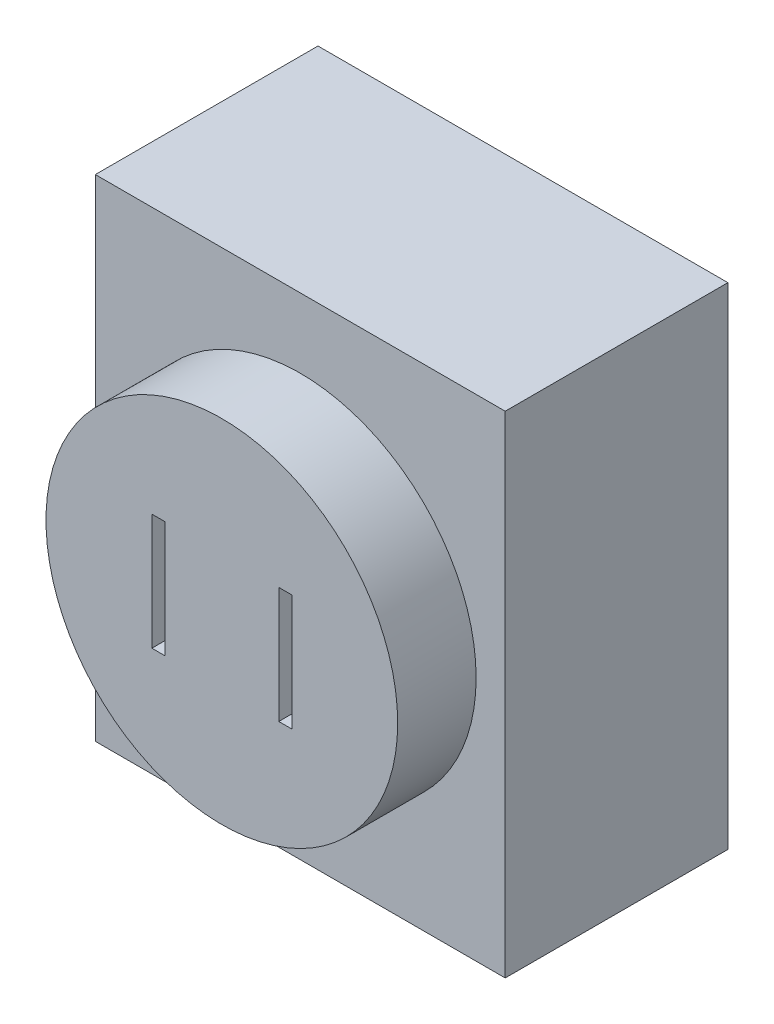
ISO-10303-21;
HEADER;
FILE_DESCRIPTION(('STEP AP214'),'2;1');
FILE_NAME('part.step','',(''),(''),'','','');
FILE_SCHEMA(('AUTOMOTIVE_DESIGN { 1 0 10303 214 1 1 1 1 }'));
ENDSEC;
DATA;
#1=APPLICATION_CONTEXT('core data for automotive mechanical design processes');
#2=APPLICATION_PROTOCOL_DEFINITION('international standard','automotive_design',2000,#1);
#3=PRODUCT_CONTEXT('',#1,'mechanical');
#4=PRODUCT('Part','Part','',(#3));
#5=PRODUCT_RELATED_PRODUCT_CATEGORY('part','',(#4));
#6=PRODUCT_DEFINITION_FORMATION('','',#4);
#7=PRODUCT_DEFINITION_CONTEXT('part definition',#1,'design');
#8=PRODUCT_DEFINITION('design','',#6,#7);
#9=PRODUCT_DEFINITION_SHAPE('','',#8);
#10=(LENGTH_UNIT() NAMED_UNIT(*) SI_UNIT(.MILLI.,.METRE.));
#11=(NAMED_UNIT(*) PLANE_ANGLE_UNIT() SI_UNIT($,.RADIAN.));
#12=(NAMED_UNIT(*) SI_UNIT($,.STERADIAN.) SOLID_ANGLE_UNIT());
#13=UNCERTAINTY_MEASURE_WITH_UNIT(LENGTH_MEASURE(1.E-05),#10,'distance_accuracy_value','');
#14=(GEOMETRIC_REPRESENTATION_CONTEXT(3) GLOBAL_UNCERTAINTY_ASSIGNED_CONTEXT((#13)) GLOBAL_UNIT_ASSIGNED_CONTEXT((#10,
#11,#12)) REPRESENTATION_CONTEXT('',''));
#15=CARTESIAN_POINT('',(0.,0.,0.));
#16=DIRECTION('',(0.,0.,1.));
#17=DIRECTION('',(1.,0.,0.));
#18=AXIS2_PLACEMENT_3D('',#15,#16,#17);
#19=CARTESIAN_POINT('',(14.859,30.4668283761168,30.226));
#20=DIRECTION('',(0.,1.,0.));
#21=DIRECTION('',(0.,0.,1.));
#22=AXIS2_PLACEMENT_3D('',#19,#20,#21);
#23=PLANE('',#22);
#24=DIRECTION('',(1.,0.,0.));
#25=VECTOR('',#24,1.);
#26=CARTESIAN_POINT('',(0.,30.4668283761168,22.2758));
#27=LINE('',#26,#25);
#28=CARTESIAN_POINT('',(14.859,30.4668283761168,22.2758));
#29=VERTEX_POINT('',#28);
#30=CARTESIAN_POINT('',(13.5508801004094,30.4668283761168,22.2758));
#31=VERTEX_POINT('',#30);
#32=EDGE_CURVE('E102',#29,#31,#27,.F.);
#33=ORIENTED_EDGE('',*,*,#32,.F.);
#34=DIRECTION('',(0.,0.,-1.));
#35=VECTOR('',#34,1.);
#36=CARTESIAN_POINT('',(14.859,30.4668283761168,30.226));
#37=LINE('',#36,#35);
#38=CARTESIAN_POINT('',(14.859,30.4668283761168,30.226));
#39=VERTEX_POINT('',#38);
#40=EDGE_CURVE('E127',#29,#39,#37,.F.);
#41=ORIENTED_EDGE('',*,*,#40,.T.);
#42=DIRECTION('',(1.,0.,0.));
#43=VECTOR('',#42,1.);
#44=CARTESIAN_POINT('',(14.859,30.4668283761168,30.226));
#45=LINE('',#44,#43);
#46=CARTESIAN_POINT('',(13.5508801004094,30.4668283761168,30.226));
#47=VERTEX_POINT('',#46);
#48=EDGE_CURVE('E142',#47,#39,#45,.T.);
#49=ORIENTED_EDGE('',*,*,#48,.F.);
#50=DIRECTION('',(0.,0.,1.));
#51=VECTOR('',#50,1.);
#52=CARTESIAN_POINT('',(13.5508801004094,30.4668283761168,30.226));
#53=LINE('',#52,#51);
#54=EDGE_CURVE('E189',#47,#31,#53,.F.);
#55=ORIENTED_EDGE('',*,*,#54,.T.);
#56=EDGE_LOOP('',(#33,#41,#49,#55));
#57=FACE_BOUND('',#56,.T.);
#58=ADVANCED_FACE('F17',(#57),#23,.F.);
#59=CARTESIAN_POINT('',(0.,0.,22.2758));
#60=DIRECTION('',(0.,0.,1.));
#61=DIRECTION('',(1.,0.,0.));
#62=AXIS2_PLACEMENT_3D('',#59,#60,#61);
#63=PLANE('',#62);
#64=ORIENTED_EDGE('',*,*,#32,.T.);
#65=DIRECTION('',(0.,1.,0.));
#66=VECTOR('',#65,1.);
#67=CARTESIAN_POINT('',(13.5508801004094,30.4668283761168,22.2758));
#68=LINE('',#67,#66);
#69=CARTESIAN_POINT('',(13.5508801004094,18.8091716238832,22.2758));
#70=VERTEX_POINT('',#69);
#71=EDGE_CURVE('E113',#31,#70,#68,.F.);
#72=ORIENTED_EDGE('',*,*,#71,.T.);
#73=DIRECTION('',(1.,0.,0.));
#74=VECTOR('',#73,1.);
#75=CARTESIAN_POINT('',(13.5508801004094,18.8091716238832,22.2758));
#76=LINE('',#75,#74);
#77=CARTESIAN_POINT('',(14.859,18.8091716238832,22.2758));
#78=VERTEX_POINT('',#77);
#79=EDGE_CURVE('E108',#70,#78,#76,.T.);
#80=ORIENTED_EDGE('',*,*,#79,.T.);
#81=DIRECTION('',(0.,1.,0.));
#82=VECTOR('',#81,1.);
#83=CARTESIAN_POINT('',(14.859,18.8091716238832,22.2758));
#84=LINE('',#83,#82);
#85=EDGE_CURVE('E111',#78,#29,#84,.T.);
#86=ORIENTED_EDGE('',*,*,#85,.T.);
#87=EDGE_LOOP('',(#64,#72,#80,#86));
#88=FACE_BOUND('',#87,.T.);
#89=ADVANCED_FACE('F110',(#88),#63,.T.);
#90=CARTESIAN_POINT('',(13.5508801004094,18.8091716238832,30.226));
#91=DIRECTION('',(0.,-1.,0.));
#92=DIRECTION('',(0.,0.,-1.));
#93=AXIS2_PLACEMENT_3D('',#90,#91,#92);
#94=PLANE('',#93);
#95=ORIENTED_EDGE('',*,*,#79,.F.);
#96=DIRECTION('',(0.,0.,1.));
#97=VECTOR('',#96,1.);
#98=CARTESIAN_POINT('',(13.5508801004094,18.8091716238832,30.226));
#99=LINE('',#98,#97);
#100=CARTESIAN_POINT('',(13.5508801004094,18.8091716238832,30.226));
#101=VERTEX_POINT('',#100);
#102=EDGE_CURVE('E186',#70,#101,#99,.T.);
#103=ORIENTED_EDGE('',*,*,#102,.T.);
#104=DIRECTION('',(1.,0.,0.));
#105=VECTOR('',#104,1.);
#106=CARTESIAN_POINT('',(13.5508801004094,18.8091716238832,30.226));
#107=LINE('',#106,#105);
#108=CARTESIAN_POINT('',(14.859,18.8091716238832,30.226));
#109=VERTEX_POINT('',#108);
#110=EDGE_CURVE('E119',#109,#101,#107,.F.);
#111=ORIENTED_EDGE('',*,*,#110,.F.);
#112=DIRECTION('',(0.,0.,-1.));
#113=VECTOR('',#112,1.);
#114=CARTESIAN_POINT('',(14.859,18.8091716238832,30.226));
#115=LINE('',#114,#113);
#116=EDGE_CURVE('E125',#109,#78,#115,.T.);
#117=ORIENTED_EDGE('',*,*,#116,.T.);
#118=EDGE_LOOP('',(#95,#103,#111,#117));
#119=FACE_BOUND('',#118,.T.);
#120=ADVANCED_FACE('F129',(#119),#94,.F.);
#121=CARTESIAN_POINT('',(27.5971198995906,30.4668283761168,30.226));
#122=DIRECTION('',(0.,1.,0.));
#123=DIRECTION('',(0.,0.,1.));
#124=AXIS2_PLACEMENT_3D('',#121,#122,#123);
#125=PLANE('',#124);
#126=DIRECTION('',(1.,0.,0.));
#127=VECTOR('',#126,1.);
#128=CARTESIAN_POINT('',(0.,30.4668283761168,22.2758));
#129=LINE('',#128,#127);
#130=CARTESIAN_POINT('',(27.5971198995906,30.4668283761168,22.2758));
#131=VERTEX_POINT('',#130);
#132=CARTESIAN_POINT('',(26.289,30.4668283761168,22.2758));
#133=VERTEX_POINT('',#132);
#134=EDGE_CURVE('E137',#131,#133,#129,.F.);
#135=ORIENTED_EDGE('',*,*,#134,.F.);
#136=DIRECTION('',(0.,0.,-1.));
#137=VECTOR('',#136,1.);
#138=CARTESIAN_POINT('',(27.5971198995906,30.4668283761168,30.226));
#139=LINE('',#138,#137);
#140=CARTESIAN_POINT('',(27.5971198995906,30.4668283761168,30.226));
#141=VERTEX_POINT('',#140);
#142=EDGE_CURVE('E177',#131,#141,#139,.F.);
#143=ORIENTED_EDGE('',*,*,#142,.T.);
#144=DIRECTION('',(1.,0.,0.));
#145=VECTOR('',#144,1.);
#146=CARTESIAN_POINT('',(27.5971198995906,30.4668283761168,30.226));
#147=LINE('',#146,#145);
#148=CARTESIAN_POINT('',(26.289,30.4668283761168,30.226));
#149=VERTEX_POINT('',#148);
#150=EDGE_CURVE('E118',#149,#141,#147,.T.);
#151=ORIENTED_EDGE('',*,*,#150,.F.);
#152=DIRECTION('',(0.,0.,1.));
#153=VECTOR('',#152,1.);
#154=CARTESIAN_POINT('',(26.289,30.4668283761168,30.226));
#155=LINE('',#154,#153);
#156=EDGE_CURVE('E174',#149,#133,#155,.F.);
#157=ORIENTED_EDGE('',*,*,#156,.T.);
#158=EDGE_LOOP('',(#135,#143,#151,#157));
#159=FACE_BOUND('',#158,.T.);
#160=ADVANCED_FACE('F250',(#159),#125,.F.);
#161=CARTESIAN_POINT('',(0.,0.,22.2758));
#162=DIRECTION('',(0.,0.,1.));
#163=DIRECTION('',(1.,0.,0.));
#164=AXIS2_PLACEMENT_3D('',#161,#162,#163);
#165=PLANE('',#164);
#166=ORIENTED_EDGE('',*,*,#134,.T.);
#167=DIRECTION('',(0.,1.,0.));
#168=VECTOR('',#167,1.);
#169=CARTESIAN_POINT('',(26.289,30.4668283761168,22.2758));
#170=LINE('',#169,#168);
#171=CARTESIAN_POINT('',(26.289,18.8091716238832,22.2758));
#172=VERTEX_POINT('',#171);
#173=EDGE_CURVE('E171',#133,#172,#170,.F.);
#174=ORIENTED_EDGE('',*,*,#173,.T.);
#175=DIRECTION('',(1.,0.,0.));
#176=VECTOR('',#175,1.);
#177=CARTESIAN_POINT('',(26.289,18.8091716238832,22.2758));
#178=LINE('',#177,#176);
#179=CARTESIAN_POINT('',(27.5971198995906,18.8091716238832,22.2758));
#180=VERTEX_POINT('',#179);
#181=EDGE_CURVE('E130',#172,#180,#178,.T.);
#182=ORIENTED_EDGE('',*,*,#181,.T.);
#183=DIRECTION('',(0.,1.,0.));
#184=VECTOR('',#183,1.);
#185=CARTESIAN_POINT('',(27.5971198995906,18.8091716238832,22.2758));
#186=LINE('',#185,#184);
#187=EDGE_CURVE('E180',#180,#131,#186,.T.);
#188=ORIENTED_EDGE('',*,*,#187,.T.);
#189=EDGE_LOOP('',(#166,#174,#182,#188));
#190=FACE_BOUND('',#189,.T.);
#191=ADVANCED_FACE('F256',(#190),#165,.T.);
#192=CARTESIAN_POINT('',(26.289,18.8091716238832,30.226));
#193=DIRECTION('',(0.,-1.,0.));
#194=DIRECTION('',(0.,0.,-1.));
#195=AXIS2_PLACEMENT_3D('',#192,#193,#194);
#196=PLANE('',#195);
#197=ORIENTED_EDGE('',*,*,#181,.F.);
#198=DIRECTION('',(0.,0.,1.));
#199=VECTOR('',#198,1.);
#200=CARTESIAN_POINT('',(26.289,18.8091716238832,30.226));
#201=LINE('',#200,#199);
#202=CARTESIAN_POINT('',(26.289,18.8091716238832,30.226));
#203=VERTEX_POINT('',#202);
#204=EDGE_CURVE('E168',#172,#203,#201,.T.);
#205=ORIENTED_EDGE('',*,*,#204,.T.);
#206=DIRECTION('',(1.,0.,0.));
#207=VECTOR('',#206,1.);
#208=CARTESIAN_POINT('',(26.289,18.8091716238832,30.226));
#209=LINE('',#208,#207);
#210=CARTESIAN_POINT('',(27.5971198995906,18.8091716238832,30.226));
#211=VERTEX_POINT('',#210);
#212=EDGE_CURVE('E132',#211,#203,#209,.F.);
#213=ORIENTED_EDGE('',*,*,#212,.F.);
#214=DIRECTION('',(0.,0.,-1.));
#215=VECTOR('',#214,1.);
#216=CARTESIAN_POINT('',(27.5971198995906,18.8091716238832,30.226));
#217=LINE('',#216,#215);
#218=EDGE_CURVE('E183',#211,#180,#217,.T.);
#219=ORIENTED_EDGE('',*,*,#218,.T.);
#220=EDGE_LOOP('',(#197,#205,#213,#219));
#221=FACE_BOUND('',#220,.T.);
#222=ADVANCED_FACE('F208',(#221),#196,.F.);
#223=CARTESIAN_POINT('',(14.859,18.8091716238832,30.226));
#224=DIRECTION('',(1.,0.,0.));
#225=DIRECTION('',(0.,0.,-1.));
#226=AXIS2_PLACEMENT_3D('',#223,#224,#225);
#227=PLANE('',#226);
#228=ORIENTED_EDGE('',*,*,#85,.F.);
#229=ORIENTED_EDGE('',*,*,#116,.F.);
#230=DIRECTION('',(0.,1.,0.));
#231=VECTOR('',#230,1.);
#232=CARTESIAN_POINT('',(14.859,0.,30.226));
#233=LINE('',#232,#231);
#234=EDGE_CURVE('E166',#39,#109,#233,.F.);
#235=ORIENTED_EDGE('',*,*,#234,.F.);
#236=ORIENTED_EDGE('',*,*,#40,.F.);
#237=EDGE_LOOP('',(#228,#229,#235,#236));
#238=FACE_BOUND('',#237,.T.);
#239=ADVANCED_FACE('F123',(#238),#227,.F.);
#240=CARTESIAN_POINT('',(13.5508801004094,30.4668283761168,30.226));
#241=DIRECTION('',(-1.,0.,0.));
#242=DIRECTION('',(0.,0.,1.));
#243=AXIS2_PLACEMENT_3D('',#240,#241,#242);
#244=PLANE('',#243);
#245=ORIENTED_EDGE('',*,*,#71,.F.);
#246=ORIENTED_EDGE('',*,*,#54,.F.);
#247=DIRECTION('',(0.,1.,0.));
#248=VECTOR('',#247,1.);
#249=CARTESIAN_POINT('',(13.5508801004094,0.,30.226));
#250=LINE('',#249,#248);
#251=EDGE_CURVE('E160',#101,#47,#250,.T.);
#252=ORIENTED_EDGE('',*,*,#251,.F.);
#253=ORIENTED_EDGE('',*,*,#102,.F.);
#254=EDGE_LOOP('',(#245,#246,#252,#253));
#255=FACE_BOUND('',#254,.T.);
#256=ADVANCED_FACE('F196',(#255),#244,.F.);
#257=CARTESIAN_POINT('',(27.5971198995906,18.8091716238832,30.226));
#258=DIRECTION('',(1.,0.,0.));
#259=DIRECTION('',(0.,0.,-1.));
#260=AXIS2_PLACEMENT_3D('',#257,#258,#259);
#261=PLANE('',#260);
#262=ORIENTED_EDGE('',*,*,#187,.F.);
#263=ORIENTED_EDGE('',*,*,#218,.F.);
#264=DIRECTION('',(0.,1.,0.));
#265=VECTOR('',#264,1.);
#266=CARTESIAN_POINT('',(27.5971198995906,0.,30.226));
#267=LINE('',#266,#265);
#268=EDGE_CURVE('E155',#141,#211,#267,.F.);
#269=ORIENTED_EDGE('',*,*,#268,.F.);
#270=ORIENTED_EDGE('',*,*,#142,.F.);
#271=EDGE_LOOP('',(#262,#263,#269,#270));
#272=FACE_BOUND('',#271,.T.);
#273=ADVANCED_FACE('F198',(#272),#261,.F.);
#274=CARTESIAN_POINT('',(26.289,30.4668283761168,30.226));
#275=DIRECTION('',(-1.,0.,0.));
#276=DIRECTION('',(0.,0.,1.));
#277=AXIS2_PLACEMENT_3D('',#274,#275,#276);
#278=PLANE('',#277);
#279=ORIENTED_EDGE('',*,*,#173,.F.);
#280=ORIENTED_EDGE('',*,*,#156,.F.);
#281=DIRECTION('',(0.,1.,0.));
#282=VECTOR('',#281,1.);
#283=CARTESIAN_POINT('',(26.289,0.,30.226));
#284=LINE('',#283,#282);
#285=EDGE_CURVE('E151',#203,#149,#284,.T.);
#286=ORIENTED_EDGE('',*,*,#285,.F.);
#287=ORIENTED_EDGE('',*,*,#204,.F.);
#288=EDGE_LOOP('',(#279,#280,#286,#287));
#289=FACE_BOUND('',#288,.T.);
#290=ADVANCED_FACE('F205',(#289),#278,.F.);
#291=CARTESIAN_POINT('',(0.,0.,30.226));
#292=DIRECTION('',(0.,0.,1.));
#293=DIRECTION('',(1.,0.,0.));
#294=AXIS2_PLACEMENT_3D('',#291,#292,#293);
#295=PLANE('',#294);
#296=ORIENTED_EDGE('',*,*,#212,.T.);
#297=ORIENTED_EDGE('',*,*,#285,.T.);
#298=ORIENTED_EDGE('',*,*,#150,.T.);
#299=ORIENTED_EDGE('',*,*,#268,.T.);
#300=EDGE_LOOP('',(#296,#297,#298,#299));
#301=FACE_BOUND('',#300,.T.);
#302=ORIENTED_EDGE('',*,*,#110,.T.);
#303=ORIENTED_EDGE('',*,*,#251,.T.);
#304=ORIENTED_EDGE('',*,*,#48,.T.);
#305=ORIENTED_EDGE('',*,*,#234,.T.);
#306=EDGE_LOOP('',(#302,#303,#304,#305));
#307=FACE_BOUND('',#306,.T.);
#308=CARTESIAN_POINT('',(20.574,24.638,30.226));
#309=DIRECTION('',(0.,0.,1.));
#310=DIRECTION('',(1.,0.,0.));
#311=AXIS2_PLACEMENT_3D('',#308,#309,#310);
#312=CIRCLE('',#311,17.653);
#313=CARTESIAN_POINT('',(38.227,24.638,30.226));
#314=VERTEX_POINT('',#313);
#315=EDGE_CURVE('E20',#314,#314,#312,.F.);
#316=ORIENTED_EDGE('',*,*,#315,.F.);
#317=EDGE_LOOP('',(#316));
#318=FACE_BOUND('',#317,.T.);
#319=ADVANCED_FACE('F192',(#301,#307,#318),#295,.T.);
#320=CARTESIAN_POINT('',(20.574,24.638,22.352));
#321=DIRECTION('',(0.,0.,1.));
#322=DIRECTION('',(1.,0.,0.));
#323=AXIS2_PLACEMENT_3D('',#320,#321,#322);
#324=CYLINDRICAL_SURFACE('',#323,17.653);
#325=ORIENTED_EDGE('',*,*,#315,.T.);
#326=EDGE_LOOP('',(#325));
#327=FACE_BOUND('',#326,.T.);
#328=CARTESIAN_POINT('',(20.574,24.638,22.352));
#329=DIRECTION('',(0.,0.,1.));
#330=DIRECTION('',(1.,0.,0.));
#331=AXIS2_PLACEMENT_3D('',#328,#329,#330);
#332=CIRCLE('',#331,17.653);
#333=CARTESIAN_POINT('',(38.227,24.638,22.352));
#334=VERTEX_POINT('',#333);
#335=EDGE_CURVE('E143',#334,#334,#332,.F.);
#336=ORIENTED_EDGE('',*,*,#335,.F.);
#337=EDGE_LOOP('',(#336));
#338=FACE_BOUND('',#337,.T.);
#339=ADVANCED_FACE('F236',(#327,#338),#324,.T.);
#340=CARTESIAN_POINT('',(0.,0.,22.352));
#341=DIRECTION('',(0.,0.,1.));
#342=DIRECTION('',(1.,0.,0.));
#343=AXIS2_PLACEMENT_3D('',#340,#341,#342);
#344=PLANE('',#343);
#345=ORIENTED_EDGE('',*,*,#335,.T.);
#346=EDGE_LOOP('',(#345));
#347=FACE_BOUND('',#346,.T.);
#348=DIRECTION('',(1.,0.,0.));
#349=VECTOR('',#348,1.);
#350=CARTESIAN_POINT('',(41.148,49.276,22.352));
#351=LINE('',#350,#349);
#352=CARTESIAN_POINT('',(0.,49.276,22.352));
#353=VERTEX_POINT('',#352);
#354=CARTESIAN_POINT('',(41.148,49.276,22.352));
#355=VERTEX_POINT('',#354);
#356=EDGE_CURVE('E403',#353,#355,#351,.T.);
#357=ORIENTED_EDGE('',*,*,#356,.F.);
#358=DIRECTION('',(0.,1.,0.));
#359=VECTOR('',#358,1.);
#360=CARTESIAN_POINT('',(0.,49.276,22.352));
#361=LINE('',#360,#359);
#362=CARTESIAN_POINT('',(0.,0.,22.352));
#363=VERTEX_POINT('',#362);
#364=EDGE_CURVE('E145',#363,#353,#361,.T.);
#365=ORIENTED_EDGE('',*,*,#364,.F.);
#366=DIRECTION('',(1.,0.,0.));
#367=VECTOR('',#366,1.);
#368=CARTESIAN_POINT('',(0.,0.,22.352));
#369=LINE('',#368,#367);
#370=CARTESIAN_POINT('',(41.148,0.,22.352));
#371=VERTEX_POINT('',#370);
#372=EDGE_CURVE('E148',#371,#363,#369,.F.);
#373=ORIENTED_EDGE('',*,*,#372,.F.);
#374=DIRECTION('',(0.,1.,0.));
#375=VECTOR('',#374,1.);
#376=CARTESIAN_POINT('',(41.148,0.,22.352));
#377=LINE('',#376,#375);
#378=EDGE_CURVE('E406',#355,#371,#377,.F.);
#379=ORIENTED_EDGE('',*,*,#378,.F.);
#380=EDGE_LOOP('',(#357,#365,#373,#379));
#381=FACE_BOUND('',#380,.T.);
#382=ADVANCED_FACE('F232',(#347,#381),#344,.T.);
#383=CARTESIAN_POINT('',(0.,49.276,0.));
#384=DIRECTION('',(-1.,0.,0.));
#385=DIRECTION('',(0.,0.,1.));
#386=AXIS2_PLACEMENT_3D('',#383,#384,#385);
#387=PLANE('',#386);
#388=DIRECTION('',(0.,0.,1.));
#389=VECTOR('',#388,1.);
#390=CARTESIAN_POINT('',(0.,49.276,0.));
#391=LINE('',#390,#389);
#392=CARTESIAN_POINT('',(0.,49.276,0.));
#393=VERTEX_POINT('',#392);
#394=EDGE_CURVE('E408',#393,#353,#391,.T.);
#395=ORIENTED_EDGE('',*,*,#394,.F.);
#396=DIRECTION('',(0.,1.,0.));
#397=VECTOR('',#396,1.);
#398=CARTESIAN_POINT('',(0.,0.,0.));
#399=LINE('',#398,#397);
#400=CARTESIAN_POINT('',(0.,0.,0.));
#401=VERTEX_POINT('',#400);
#402=EDGE_CURVE('E410',#393,#401,#399,.F.);
#403=ORIENTED_EDGE('',*,*,#402,.T.);
#404=DIRECTION('',(0.,0.,-1.));
#405=VECTOR('',#404,1.);
#406=CARTESIAN_POINT('',(0.,0.,0.));
#407=LINE('',#406,#405);
#408=EDGE_CURVE('E418',#363,#401,#407,.T.);
#409=ORIENTED_EDGE('',*,*,#408,.F.);
#410=ORIENTED_EDGE('',*,*,#364,.T.);
#411=EDGE_LOOP('',(#395,#403,#409,#410));
#412=FACE_BOUND('',#411,.T.);
#413=ADVANCED_FACE('F228',(#412),#387,.T.);
#414=CARTESIAN_POINT('',(0.,0.,0.));
#415=DIRECTION('',(0.,-1.,0.));
#416=DIRECTION('',(0.,0.,-1.));
#417=AXIS2_PLACEMENT_3D('',#414,#415,#416);
#418=PLANE('',#417);
#419=ORIENTED_EDGE('',*,*,#408,.T.);
#420=DIRECTION('',(1.,0.,0.));
#421=VECTOR('',#420,1.);
#422=CARTESIAN_POINT('',(0.,0.,0.));
#423=LINE('',#422,#421);
#424=CARTESIAN_POINT('',(41.148,0.,0.));
#425=VERTEX_POINT('',#424);
#426=EDGE_CURVE('E422',#401,#425,#423,.T.);
#427=ORIENTED_EDGE('',*,*,#426,.T.);
#428=DIRECTION('',(0.,0.,-1.));
#429=VECTOR('',#428,1.);
#430=CARTESIAN_POINT('',(41.148,0.,0.));
#431=LINE('',#430,#429);
#432=EDGE_CURVE('E412',#371,#425,#431,.T.);
#433=ORIENTED_EDGE('',*,*,#432,.F.);
#434=ORIENTED_EDGE('',*,*,#372,.T.);
#435=EDGE_LOOP('',(#419,#427,#433,#434));
#436=FACE_BOUND('',#435,.T.);
#437=ADVANCED_FACE('F224',(#436),#418,.T.);
#438=CARTESIAN_POINT('',(41.148,0.,0.));
#439=DIRECTION('',(1.,0.,0.));
#440=DIRECTION('',(0.,0.,-1.));
#441=AXIS2_PLACEMENT_3D('',#438,#439,#440);
#442=PLANE('',#441);
#443=ORIENTED_EDGE('',*,*,#432,.T.);
#444=DIRECTION('',(0.,1.,0.));
#445=VECTOR('',#444,1.);
#446=CARTESIAN_POINT('',(41.148,0.,0.));
#447=LINE('',#446,#445);
#448=CARTESIAN_POINT('',(41.148,49.276,0.));
#449=VERTEX_POINT('',#448);
#450=EDGE_CURVE('E26',#425,#449,#447,.T.);
#451=ORIENTED_EDGE('',*,*,#450,.T.);
#452=DIRECTION('',(0.,0.,1.));
#453=VECTOR('',#452,1.);
#454=CARTESIAN_POINT('',(41.148,49.276,0.));
#455=LINE('',#454,#453);
#456=EDGE_CURVE('E34',#355,#449,#455,.F.);
#457=ORIENTED_EDGE('',*,*,#456,.F.);
#458=ORIENTED_EDGE('',*,*,#378,.T.);
#459=EDGE_LOOP('',(#443,#451,#457,#458));
#460=FACE_BOUND('',#459,.T.);
#461=ADVANCED_FACE('F218',(#460),#442,.T.);
#462=CARTESIAN_POINT('',(41.148,49.276,0.));
#463=DIRECTION('',(0.,1.,0.));
#464=DIRECTION('',(0.,0.,1.));
#465=AXIS2_PLACEMENT_3D('',#462,#463,#464);
#466=PLANE('',#465);
#467=ORIENTED_EDGE('',*,*,#456,.T.);
#468=DIRECTION('',(1.,0.,0.));
#469=VECTOR('',#468,1.);
#470=CARTESIAN_POINT('',(0.,49.276,0.));
#471=LINE('',#470,#469);
#472=EDGE_CURVE('E11',#449,#393,#471,.F.);
#473=ORIENTED_EDGE('',*,*,#472,.T.);
#474=ORIENTED_EDGE('',*,*,#394,.T.);
#475=ORIENTED_EDGE('',*,*,#356,.T.);
#476=EDGE_LOOP('',(#467,#473,#474,#475));
#477=FACE_BOUND('',#476,.T.);
#478=ADVANCED_FACE('F212',(#477),#466,.T.);
#479=CARTESIAN_POINT('',(0.,0.,0.));
#480=DIRECTION('',(0.,0.,1.));
#481=DIRECTION('',(1.,0.,0.));
#482=AXIS2_PLACEMENT_3D('',#479,#480,#481);
#483=PLANE('',#482);
#484=ORIENTED_EDGE('',*,*,#450,.F.);
#485=ORIENTED_EDGE('',*,*,#426,.F.);
#486=ORIENTED_EDGE('',*,*,#402,.F.);
#487=ORIENTED_EDGE('',*,*,#472,.F.);
#488=EDGE_LOOP('',(#484,#485,#486,#487));
#489=FACE_BOUND('',#488,.T.);
#490=ADVANCED_FACE('F210',(#489),#483,.F.);
#491=CLOSED_SHELL('',(#58,#89,#120,#160,#191,#222,#239,#256,#273,#290,#319,#339,#382,#413,#437,
#461,#478,#490));
#492=MANIFOLD_SOLID_BREP('B1',#491);
#493=ADVANCED_BREP_SHAPE_REPRESENTATION('',(#18,#492),#14);
#494=SHAPE_DEFINITION_REPRESENTATION(#9,#493);
ENDSEC;
END-ISO-10303-21;
